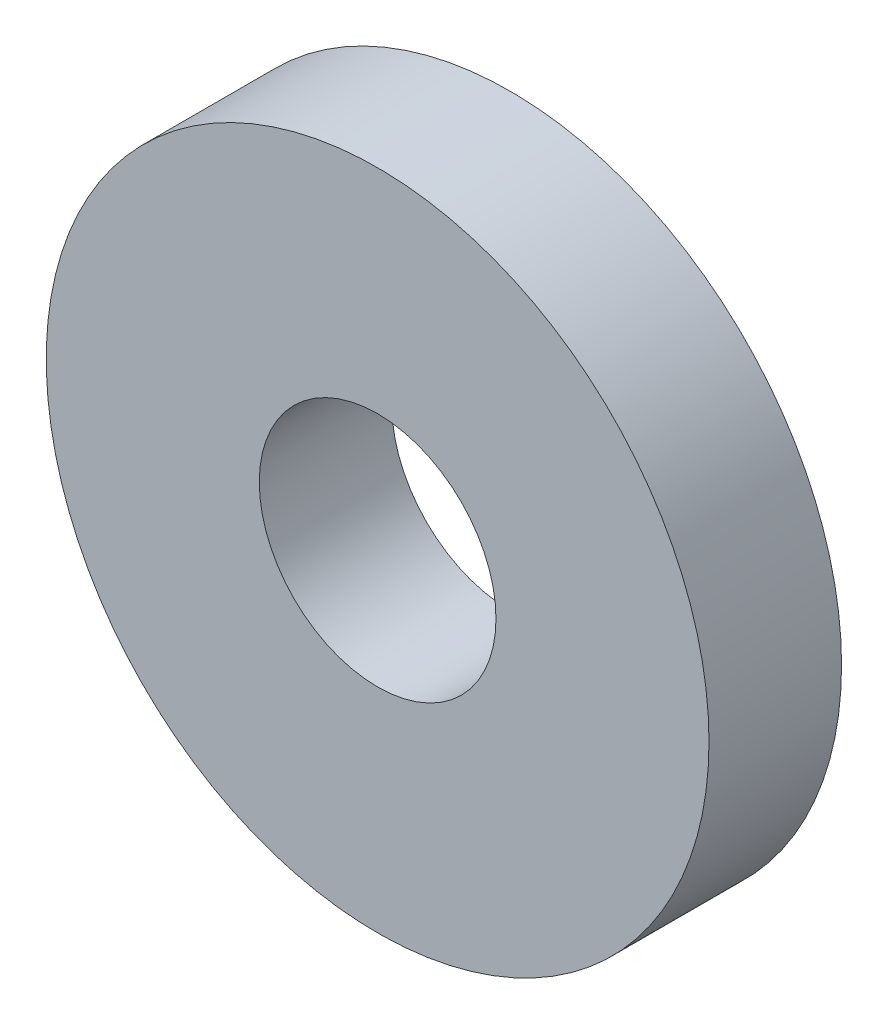
ISO-10303-21;
HEADER;
FILE_DESCRIPTION(('STEP AP214'),'2;1');
FILE_NAME('part.step','',(''),(''),'','','');
FILE_SCHEMA(('AUTOMOTIVE_DESIGN { 1 0 10303 214 1 1 1 1 }'));
ENDSEC;
DATA;
#1=APPLICATION_CONTEXT('core data for automotive mechanical design processes');
#2=APPLICATION_PROTOCOL_DEFINITION('international standard','automotive_design',2000,#1);
#3=PRODUCT_CONTEXT('',#1,'mechanical');
#4=PRODUCT('Part','Part','',(#3));
#5=PRODUCT_RELATED_PRODUCT_CATEGORY('part','',(#4));
#6=PRODUCT_DEFINITION_FORMATION('','',#4);
#7=PRODUCT_DEFINITION_CONTEXT('part definition',#1,'design');
#8=PRODUCT_DEFINITION('design','',#6,#7);
#9=PRODUCT_DEFINITION_SHAPE('','',#8);
#10=(LENGTH_UNIT() NAMED_UNIT(*) SI_UNIT(.MILLI.,.METRE.));
#11=(NAMED_UNIT(*) PLANE_ANGLE_UNIT() SI_UNIT($,.RADIAN.));
#12=(NAMED_UNIT(*) SI_UNIT($,.STERADIAN.) SOLID_ANGLE_UNIT());
#13=UNCERTAINTY_MEASURE_WITH_UNIT(LENGTH_MEASURE(1.E-05),#10,'distance_accuracy_value','');
#14=(GEOMETRIC_REPRESENTATION_CONTEXT(3) GLOBAL_UNCERTAINTY_ASSIGNED_CONTEXT((#13)) GLOBAL_UNIT_ASSIGNED_CONTEXT((#10,
#11,#12)) REPRESENTATION_CONTEXT('',''));
#15=CARTESIAN_POINT('',(0.,0.,0.));
#16=DIRECTION('',(0.,0.,1.));
#17=DIRECTION('',(1.,0.,0.));
#18=AXIS2_PLACEMENT_3D('',#15,#16,#17);
#19=CARTESIAN_POINT('',(0.,0.,2.8));
#20=DIRECTION('',(0.,0.,-1.));
#21=DIRECTION('',(-1.,0.,0.));
#22=AXIS2_PLACEMENT_3D('',#19,#20,#21);
#23=CYLINDRICAL_SURFACE('',#22,7.);
#24=CARTESIAN_POINT('',(0.,0.,2.8));
#25=DIRECTION('',(0.,0.,1.));
#26=DIRECTION('',(1.,0.,0.));
#27=AXIS2_PLACEMENT_3D('',#24,#25,#26);
#28=CIRCLE('',#27,7.);
#29=CARTESIAN_POINT('',(7.,0.,2.8));
#30=VERTEX_POINT('',#29);
#31=EDGE_CURVE('E10',#30,#30,#28,.T.);
#32=ORIENTED_EDGE('',*,*,#31,.F.);
#33=EDGE_LOOP('',(#32));
#34=FACE_BOUND('',#33,.T.);
#35=CARTESIAN_POINT('',(0.,0.,0.));
#36=DIRECTION('',(0.,0.,1.));
#37=DIRECTION('',(1.,0.,0.));
#38=AXIS2_PLACEMENT_3D('',#35,#36,#37);
#39=CIRCLE('',#38,7.);
#40=CARTESIAN_POINT('',(7.,0.,0.));
#41=VERTEX_POINT('',#40);
#42=EDGE_CURVE('E36',#41,#41,#39,.T.);
#43=ORIENTED_EDGE('',*,*,#42,.T.);
#44=EDGE_LOOP('',(#43));
#45=FACE_BOUND('',#44,.T.);
#46=ADVANCED_FACE('F33',(#34,#45),#23,.T.);
#47=CARTESIAN_POINT('',(0.,0.,2.8));
#48=DIRECTION('',(0.,0.,1.));
#49=DIRECTION('',(1.,0.,0.));
#50=AXIS2_PLACEMENT_3D('',#47,#48,#49);
#51=PLANE('',#50);
#52=CARTESIAN_POINT('',(0.,0.,2.8));
#53=DIRECTION('',(0.,0.,1.));
#54=DIRECTION('',(1.,0.,0.));
#55=AXIS2_PLACEMENT_3D('',#52,#53,#54);
#56=CIRCLE('',#55,2.5);
#57=CARTESIAN_POINT('',(2.5,0.,2.8));
#58=VERTEX_POINT('',#57);
#59=EDGE_CURVE('E45',#58,#58,#56,.T.);
#60=ORIENTED_EDGE('',*,*,#59,.F.);
#61=EDGE_LOOP('',(#60));
#62=FACE_BOUND('',#61,.T.);
#63=ORIENTED_EDGE('',*,*,#31,.T.);
#64=EDGE_LOOP('',(#63));
#65=FACE_BOUND('',#64,.T.);
#66=ADVANCED_FACE('F60',(#62,#65),#51,.T.);
#67=CARTESIAN_POINT('',(0.,0.,0.));
#68=DIRECTION('',(0.,0.,1.));
#69=DIRECTION('',(1.,0.,0.));
#70=AXIS2_PLACEMENT_3D('',#67,#68,#69);
#71=PLANE('',#70);
#72=CARTESIAN_POINT('',(0.,0.,0.));
#73=DIRECTION('',(0.,0.,1.));
#74=DIRECTION('',(1.,0.,0.));
#75=AXIS2_PLACEMENT_3D('',#72,#73,#74);
#76=CIRCLE('',#75,2.5);
#77=CARTESIAN_POINT('',(2.5,0.,0.));
#78=VERTEX_POINT('',#77);
#79=EDGE_CURVE('E43',#78,#78,#76,.T.);
#80=ORIENTED_EDGE('',*,*,#79,.T.);
#81=EDGE_LOOP('',(#80));
#82=FACE_BOUND('',#81,.T.);
#83=ORIENTED_EDGE('',*,*,#42,.F.);
#84=EDGE_LOOP('',(#83));
#85=FACE_BOUND('',#84,.T.);
#86=ADVANCED_FACE('F51',(#82,#85),#71,.F.);
#87=CARTESIAN_POINT('',(0.,0.,0.));
#88=DIRECTION('',(0.,0.,1.));
#89=DIRECTION('',(1.,0.,0.));
#90=AXIS2_PLACEMENT_3D('',#87,#88,#89);
#91=CYLINDRICAL_SURFACE('',#90,2.5);
#92=ORIENTED_EDGE('',*,*,#79,.F.);
#93=EDGE_LOOP('',(#92));
#94=FACE_BOUND('',#93,.T.);
#95=ORIENTED_EDGE('',*,*,#59,.T.);
#96=EDGE_LOOP('',(#95));
#97=FACE_BOUND('',#96,.T.);
#98=ADVANCED_FACE('F54',(#94,#97),#91,.F.);
#99=CLOSED_SHELL('',(#46,#66,#86,#98));
#100=MANIFOLD_SOLID_BREP('B2',#99);
#101=ADVANCED_BREP_SHAPE_REPRESENTATION('',(#18,#100),#14);
#102=SHAPE_DEFINITION_REPRESENTATION(#9,#101);
ENDSEC;
END-ISO-10303-21;
